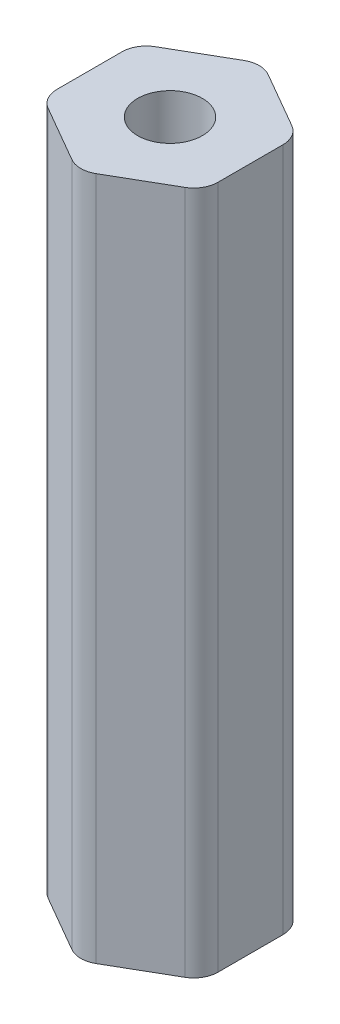
ISO-10303-21;
HEADER;
FILE_DESCRIPTION(('STEP AP214'),'2;1');
FILE_NAME('part.step','',(''),(''),'','','');
FILE_SCHEMA(('AUTOMOTIVE_DESIGN { 1 0 10303 214 1 1 1 1 }'));
ENDSEC;
DATA;
#1=APPLICATION_CONTEXT('core data for automotive mechanical design processes');
#2=APPLICATION_PROTOCOL_DEFINITION('international standard','automotive_design',2000,#1);
#3=PRODUCT_CONTEXT('',#1,'mechanical');
#4=PRODUCT('Part','Part','',(#3));
#5=PRODUCT_RELATED_PRODUCT_CATEGORY('part','',(#4));
#6=PRODUCT_DEFINITION_FORMATION('','',#4);
#7=PRODUCT_DEFINITION_CONTEXT('part definition',#1,'design');
#8=PRODUCT_DEFINITION('design','',#6,#7);
#9=PRODUCT_DEFINITION_SHAPE('','',#8);
#10=(LENGTH_UNIT() NAMED_UNIT(*) SI_UNIT(.MILLI.,.METRE.));
#11=(NAMED_UNIT(*) PLANE_ANGLE_UNIT() SI_UNIT($,.RADIAN.));
#12=(NAMED_UNIT(*) SI_UNIT($,.STERADIAN.) SOLID_ANGLE_UNIT());
#13=UNCERTAINTY_MEASURE_WITH_UNIT(LENGTH_MEASURE(1.E-05),#10,'distance_accuracy_value','');
#14=(GEOMETRIC_REPRESENTATION_CONTEXT(3) GLOBAL_UNCERTAINTY_ASSIGNED_CONTEXT((#13)) GLOBAL_UNIT_ASSIGNED_CONTEXT((#10,
#11,#12)) REPRESENTATION_CONTEXT('',''));
#15=CARTESIAN_POINT('',(0.,0.,0.));
#16=DIRECTION('',(0.,0.,1.));
#17=DIRECTION('',(1.,0.,0.));
#18=AXIS2_PLACEMENT_3D('',#15,#16,#17);
#19=CARTESIAN_POINT('',(0.,53.975,0.));
#20=DIRECTION('',(0.,1.,0.));
#21=DIRECTION('',(0.,0.,1.));
#22=AXIS2_PLACEMENT_3D('',#19,#20,#21);
#23=PLANE('',#22);
#24=DIRECTION('',(-0.866025403784438,0.,0.500000000000001));
#25=VECTOR('',#24,1.);
#26=CARTESIAN_POINT('',(0.,53.975,-7.33234841870824));
#27=LINE('',#26,#25);
#28=CARTESIAN_POINT('',(-0.952499999999994,53.975,-6.78242228730512));
#29=VERTEX_POINT('',#28);
#30=CARTESIAN_POINT('',(-5.3975,53.975,-4.21610034075723));
#31=VERTEX_POINT('',#30);
#32=EDGE_CURVE('E245',#29,#31,#27,.T.);
#33=ORIENTED_EDGE('',*,*,#32,.T.);
#34=CARTESIAN_POINT('',(-4.445,53.975,-2.56632194654787));
#35=DIRECTION('',(0.,1.,0.));
#36=DIRECTION('',(0.,0.,1.));
#37=AXIS2_PLACEMENT_3D('',#34,#35,#36);
#38=CIRCLE('',#37,1.905);
#39=CARTESIAN_POINT('',(-6.35,53.975,-2.56632194654786));
#40=VERTEX_POINT('',#39);
#41=EDGE_CURVE('E195',#31,#40,#38,.T.);
#42=ORIENTED_EDGE('',*,*,#41,.T.);
#43=DIRECTION('',(0.,0.,1.));
#44=VECTOR('',#43,1.);
#45=CARTESIAN_POINT('',(-6.35,53.975,-3.6661742093541));
#46=LINE('',#45,#44);
#47=CARTESIAN_POINT('',(-6.34999999999998,53.975,2.56632194654791));
#48=VERTEX_POINT('',#47);
#49=EDGE_CURVE('E151',#40,#48,#46,.T.);
#50=ORIENTED_EDGE('',*,*,#49,.T.);
#51=CARTESIAN_POINT('',(-4.44499999999998,53.975,2.5663219465479));
#52=DIRECTION('',(0.,1.,0.));
#53=DIRECTION('',(0.,0.,1.));
#54=AXIS2_PLACEMENT_3D('',#51,#52,#53);
#55=CIRCLE('',#54,1.905);
#56=CARTESIAN_POINT('',(-5.39749999999997,53.975,4.21610034075726));
#57=VERTEX_POINT('',#56);
#58=EDGE_CURVE('E189',#48,#57,#55,.T.);
#59=ORIENTED_EDGE('',*,*,#58,.T.);
#60=DIRECTION('',(0.866025403784442,0.,0.499999999999995));
#61=VECTOR('',#60,1.);
#62=CARTESIAN_POINT('',(-6.34999999999998,53.975,3.66617420935415));
#63=LINE('',#62,#61);
#64=CARTESIAN_POINT('',(-0.952499999999955,53.975,6.78242228730512));
#65=VERTEX_POINT('',#64);
#66=EDGE_CURVE('E227',#57,#65,#63,.T.);
#67=ORIENTED_EDGE('',*,*,#66,.T.);
#68=CARTESIAN_POINT('',(0.,53.975,5.13264389309576));
#69=DIRECTION('',(0.,1.,0.));
#70=DIRECTION('',(0.,0.,1.));
#71=AXIS2_PLACEMENT_3D('',#68,#69,#70);
#72=CIRCLE('',#71,1.905);
#73=CARTESIAN_POINT('',(0.952500000000049,53.975,6.78242228730511));
#74=VERTEX_POINT('',#73);
#75=EDGE_CURVE('E186',#65,#74,#72,.T.);
#76=ORIENTED_EDGE('',*,*,#75,.T.);
#77=DIRECTION('',(0.866025403784435,0.,-0.500000000000007));
#78=VECTOR('',#77,1.);
#79=CARTESIAN_POINT('',(0.,53.975,7.33234841870824));
#80=LINE('',#79,#78);
#81=CARTESIAN_POINT('',(5.39750000000003,53.975,4.21610034075719));
#82=VERTEX_POINT('',#81);
#83=EDGE_CURVE('E217',#74,#82,#80,.T.);
#84=ORIENTED_EDGE('',*,*,#83,.T.);
#85=CARTESIAN_POINT('',(4.44500000000001,53.975,2.56632194654784));
#86=DIRECTION('',(0.,1.,0.));
#87=DIRECTION('',(0.,0.,1.));
#88=AXIS2_PLACEMENT_3D('',#85,#86,#87);
#89=CIRCLE('',#88,1.905);
#90=CARTESIAN_POINT('',(6.35000000000001,53.975,2.56632194654782));
#91=VERTEX_POINT('',#90);
#92=EDGE_CURVE('E63',#82,#91,#89,.T.);
#93=ORIENTED_EDGE('',*,*,#92,.T.);
#94=DIRECTION('',(0.,0.,-1.));
#95=VECTOR('',#94,1.);
#96=CARTESIAN_POINT('',(6.35000000000002,53.975,3.66617420935406));
#97=LINE('',#96,#95);
#98=CARTESIAN_POINT('',(6.34999999999996,53.975,-2.56632194654796));
#99=VERTEX_POINT('',#98);
#100=EDGE_CURVE('E174',#91,#99,#97,.T.);
#101=ORIENTED_EDGE('',*,*,#100,.T.);
#102=CARTESIAN_POINT('',(4.44499999999996,53.975,-2.56632194654794));
#103=DIRECTION('',(0.,1.,0.));
#104=DIRECTION('',(0.,0.,1.));
#105=AXIS2_PLACEMENT_3D('',#102,#103,#104);
#106=CIRCLE('',#105,1.905);
#107=CARTESIAN_POINT('',(5.39749999999995,53.975,-4.2161003407573));
#108=VERTEX_POINT('',#107);
#109=EDGE_CURVE('E191',#99,#108,#106,.T.);
#110=ORIENTED_EDGE('',*,*,#109,.T.);
#111=DIRECTION('',(-0.866025403784441,0.,-0.499999999999995));
#112=VECTOR('',#111,1.);
#113=CARTESIAN_POINT('',(6.34999999999995,53.975,-3.66617420935419));
#114=LINE('',#113,#112);
#115=CARTESIAN_POINT('',(0.952499999999998,53.975,-6.78242228730513));
#116=VERTEX_POINT('',#115);
#117=EDGE_CURVE('E173',#108,#116,#114,.T.);
#118=ORIENTED_EDGE('',*,*,#117,.T.);
#119=CARTESIAN_POINT('',(0.,53.975,-5.13264389309577));
#120=DIRECTION('',(0.,1.,0.));
#121=DIRECTION('',(0.,0.,1.));
#122=AXIS2_PLACEMENT_3D('',#119,#120,#121);
#123=CIRCLE('',#122,1.905);
#124=EDGE_CURVE('E193',#116,#29,#123,.T.);
#125=ORIENTED_EDGE('',*,*,#124,.T.);
#126=EDGE_LOOP('',(#33,#42,#50,#59,#67,#76,#84,#93,#101,#110,#118,#125));
#127=FACE_BOUND('',#126,.T.);
#128=CARTESIAN_POINT('',(0.,53.975,0.));
#129=DIRECTION('',(0.,1.,0.));
#130=DIRECTION('',(0.,0.,1.));
#131=AXIS2_PLACEMENT_3D('',#128,#129,#130);
#132=CIRCLE('',#131,2.5527);
#133=CARTESIAN_POINT('',(0.,53.975,2.5527));
#134=VERTEX_POINT('',#133);
#135=EDGE_CURVE('E231',#134,#134,#132,.T.);
#136=ORIENTED_EDGE('',*,*,#135,.F.);
#137=EDGE_LOOP('',(#136));
#138=FACE_BOUND('',#137,.T.);
#139=ADVANCED_FACE('F41',(#127,#138),#23,.T.);
#140=CARTESIAN_POINT('',(0.,0.,0.));
#141=DIRECTION('',(0.,1.,0.));
#142=DIRECTION('',(0.,0.,1.));
#143=AXIS2_PLACEMENT_3D('',#140,#141,#142);
#144=PLANE('',#143);
#145=DIRECTION('',(0.,0.,1.));
#146=VECTOR('',#145,1.);
#147=CARTESIAN_POINT('',(-6.35,0.,-3.6661742093541));
#148=LINE('',#147,#146);
#149=CARTESIAN_POINT('',(-6.35,0.,-2.56632194654786));
#150=VERTEX_POINT('',#149);
#151=CARTESIAN_POINT('',(-6.34999999999998,0.,2.56632194654791));
#152=VERTEX_POINT('',#151);
#153=EDGE_CURVE('E148',#150,#152,#148,.T.);
#154=ORIENTED_EDGE('',*,*,#153,.F.);
#155=CARTESIAN_POINT('',(-4.445,0.,-2.56632194654787));
#156=DIRECTION('',(0.,1.,0.));
#157=DIRECTION('',(0.,0.,1.));
#158=AXIS2_PLACEMENT_3D('',#155,#156,#157);
#159=CIRCLE('',#158,1.905);
#160=CARTESIAN_POINT('',(-5.3975,0.,-4.21610034075723));
#161=VERTEX_POINT('',#160);
#162=EDGE_CURVE('E131',#150,#161,#159,.F.);
#163=ORIENTED_EDGE('',*,*,#162,.T.);
#164=DIRECTION('',(-0.866025403784438,0.,0.500000000000001));
#165=VECTOR('',#164,1.);
#166=CARTESIAN_POINT('',(0.,0.,-7.33234841870824));
#167=LINE('',#166,#165);
#168=CARTESIAN_POINT('',(-0.952499999999994,0.,-6.78242228730512));
#169=VERTEX_POINT('',#168);
#170=EDGE_CURVE('E160',#169,#161,#167,.T.);
#171=ORIENTED_EDGE('',*,*,#170,.F.);
#172=CARTESIAN_POINT('',(0.,0.,-5.13264389309577));
#173=DIRECTION('',(0.,1.,0.));
#174=DIRECTION('',(0.,0.,1.));
#175=AXIS2_PLACEMENT_3D('',#172,#173,#174);
#176=CIRCLE('',#175,1.905);
#177=CARTESIAN_POINT('',(0.952499999999998,0.,-6.78242228730513));
#178=VERTEX_POINT('',#177);
#179=EDGE_CURVE('E142',#169,#178,#176,.F.);
#180=ORIENTED_EDGE('',*,*,#179,.T.);
#181=DIRECTION('',(-0.866025403784441,0.,-0.499999999999995));
#182=VECTOR('',#181,1.);
#183=CARTESIAN_POINT('',(6.34999999999995,0.,-3.66617420935419));
#184=LINE('',#183,#182);
#185=CARTESIAN_POINT('',(5.39749999999995,0.,-4.2161003407573));
#186=VERTEX_POINT('',#185);
#187=EDGE_CURVE('E165',#186,#178,#184,.T.);
#188=ORIENTED_EDGE('',*,*,#187,.F.);
#189=CARTESIAN_POINT('',(4.44499999999996,0.,-2.56632194654794));
#190=DIRECTION('',(0.,1.,0.));
#191=DIRECTION('',(0.,0.,1.));
#192=AXIS2_PLACEMENT_3D('',#189,#190,#191);
#193=CIRCLE('',#192,1.905);
#194=CARTESIAN_POINT('',(6.34999999999996,0.,-2.56632194654796));
#195=VERTEX_POINT('',#194);
#196=EDGE_CURVE('E180',#186,#195,#193,.F.);
#197=ORIENTED_EDGE('',*,*,#196,.T.);
#198=DIRECTION('',(0.,0.,-1.));
#199=VECTOR('',#198,1.);
#200=CARTESIAN_POINT('',(6.35000000000002,0.,3.66617420935406));
#201=LINE('',#200,#199);
#202=CARTESIAN_POINT('',(6.35000000000001,0.,2.56632194654782));
#203=VERTEX_POINT('',#202);
#204=EDGE_CURVE('E171',#203,#195,#201,.T.);
#205=ORIENTED_EDGE('',*,*,#204,.F.);
#206=CARTESIAN_POINT('',(4.44500000000001,0.,2.56632194654784));
#207=DIRECTION('',(0.,1.,0.));
#208=DIRECTION('',(0.,0.,1.));
#209=AXIS2_PLACEMENT_3D('',#206,#207,#208);
#210=CIRCLE('',#209,1.905);
#211=CARTESIAN_POINT('',(5.39750000000003,0.,4.21610034075719));
#212=VERTEX_POINT('',#211);
#213=EDGE_CURVE('E177',#203,#212,#210,.F.);
#214=ORIENTED_EDGE('',*,*,#213,.T.);
#215=DIRECTION('',(0.866025403784435,0.,-0.500000000000007));
#216=VECTOR('',#215,1.);
#217=CARTESIAN_POINT('',(0.,0.,7.33234841870824));
#218=LINE('',#217,#216);
#219=CARTESIAN_POINT('',(0.952500000000049,0.,6.78242228730511));
#220=VERTEX_POINT('',#219);
#221=EDGE_CURVE('E163',#220,#212,#218,.T.);
#222=ORIENTED_EDGE('',*,*,#221,.F.);
#223=CARTESIAN_POINT('',(0.,0.,5.13264389309576));
#224=DIRECTION('',(0.,1.,0.));
#225=DIRECTION('',(0.,0.,1.));
#226=AXIS2_PLACEMENT_3D('',#223,#224,#225);
#227=CIRCLE('',#226,1.905);
#228=CARTESIAN_POINT('',(-0.952499999999955,0.,6.78242228730512));
#229=VERTEX_POINT('',#228);
#230=EDGE_CURVE('E152',#220,#229,#227,.F.);
#231=ORIENTED_EDGE('',*,*,#230,.T.);
#232=DIRECTION('',(0.866025403784442,0.,0.499999999999995));
#233=VECTOR('',#232,1.);
#234=CARTESIAN_POINT('',(-6.34999999999998,0.,3.66617420935415));
#235=LINE('',#234,#233);
#236=CARTESIAN_POINT('',(-5.39749999999997,0.,4.21610034075726));
#237=VERTEX_POINT('',#236);
#238=EDGE_CURVE('E159',#237,#229,#235,.T.);
#239=ORIENTED_EDGE('',*,*,#238,.F.);
#240=CARTESIAN_POINT('',(-4.44499999999998,0.,2.5663219465479));
#241=DIRECTION('',(0.,1.,0.));
#242=DIRECTION('',(0.,0.,1.));
#243=AXIS2_PLACEMENT_3D('',#240,#241,#242);
#244=CIRCLE('',#243,1.905);
#245=EDGE_CURVE('E158',#237,#152,#244,.F.);
#246=ORIENTED_EDGE('',*,*,#245,.T.);
#247=EDGE_LOOP('',(#154,#163,#171,#180,#188,#197,#205,#214,#222,#231,#239,#246));
#248=FACE_BOUND('',#247,.T.);
#249=CARTESIAN_POINT('',(0.,0.,0.));
#250=DIRECTION('',(0.,1.,0.));
#251=DIRECTION('',(0.,0.,1.));
#252=AXIS2_PLACEMENT_3D('',#249,#250,#251);
#253=CIRCLE('',#252,2.5527);
#254=CARTESIAN_POINT('',(0.,0.,2.5527));
#255=VERTEX_POINT('',#254);
#256=EDGE_CURVE('E236',#255,#255,#253,.T.);
#257=ORIENTED_EDGE('',*,*,#256,.T.);
#258=EDGE_LOOP('',(#257));
#259=FACE_BOUND('',#258,.T.);
#260=ADVANCED_FACE('F155',(#248,#259),#144,.F.);
#261=CARTESIAN_POINT('',(6.34999999999995,53.975,-3.66617420935419));
#262=DIRECTION('',(-0.499999999999995,0.,0.866025403784441));
#263=DIRECTION('',(0.866025403784441,0.,0.499999999999995));
#264=AXIS2_PLACEMENT_3D('',#261,#262,#263);
#265=PLANE('',#264);
#266=ORIENTED_EDGE('',*,*,#187,.T.);
#267=DIRECTION('',(0.,-1.,0.));
#268=VECTOR('',#267,1.);
#269=CARTESIAN_POINT('',(0.952499999999998,53.975,-6.78242228730513));
#270=LINE('',#269,#268);
#271=EDGE_CURVE('E200',#178,#116,#270,.F.);
#272=ORIENTED_EDGE('',*,*,#271,.T.);
#273=ORIENTED_EDGE('',*,*,#117,.F.);
#274=DIRECTION('',(0.,-1.,0.));
#275=VECTOR('',#274,1.);
#276=CARTESIAN_POINT('',(5.39749999999995,53.975,-4.2161003407573));
#277=LINE('',#276,#275);
#278=EDGE_CURVE('E197',#108,#186,#277,.T.);
#279=ORIENTED_EDGE('',*,*,#278,.T.);
#280=EDGE_LOOP('',(#266,#272,#273,#279));
#281=FACE_BOUND('',#280,.T.);
#282=ADVANCED_FACE('F269',(#281),#265,.F.);
#283=CARTESIAN_POINT('',(0.,53.975,-7.33234841870824));
#284=DIRECTION('',(0.500000000000001,0.,0.866025403784438));
#285=DIRECTION('',(0.866025403784438,0.,-0.500000000000001));
#286=AXIS2_PLACEMENT_3D('',#283,#284,#285);
#287=PLANE('',#286);
#288=ORIENTED_EDGE('',*,*,#170,.T.);
#289=DIRECTION('',(0.,-1.,0.));
#290=VECTOR('',#289,1.);
#291=CARTESIAN_POINT('',(-5.3975,53.975,-4.21610034075722));
#292=LINE('',#291,#290);
#293=EDGE_CURVE('E136',#161,#31,#292,.F.);
#294=ORIENTED_EDGE('',*,*,#293,.T.);
#295=ORIENTED_EDGE('',*,*,#32,.F.);
#296=DIRECTION('',(0.,-1.,0.));
#297=VECTOR('',#296,1.);
#298=CARTESIAN_POINT('',(-0.952499999999994,53.975,-6.78242228730512));
#299=LINE('',#298,#297);
#300=EDGE_CURVE('E141',#29,#169,#299,.T.);
#301=ORIENTED_EDGE('',*,*,#300,.T.);
#302=EDGE_LOOP('',(#288,#294,#295,#301));
#303=FACE_BOUND('',#302,.T.);
#304=ADVANCED_FACE('F262',(#303),#287,.F.);
#305=CARTESIAN_POINT('',(-6.35,53.975,-3.6661742093541));
#306=DIRECTION('',(1.,0.,0.));
#307=DIRECTION('',(0.,0.,-1.));
#308=AXIS2_PLACEMENT_3D('',#305,#306,#307);
#309=PLANE('',#308);
#310=ORIENTED_EDGE('',*,*,#49,.F.);
#311=DIRECTION('',(0.,-1.,0.));
#312=VECTOR('',#311,1.);
#313=CARTESIAN_POINT('',(-6.35,53.975,-2.56632194654786));
#314=LINE('',#313,#312);
#315=EDGE_CURVE('E135',#40,#150,#314,.T.);
#316=ORIENTED_EDGE('',*,*,#315,.T.);
#317=ORIENTED_EDGE('',*,*,#153,.T.);
#318=DIRECTION('',(0.,-1.,0.));
#319=VECTOR('',#318,1.);
#320=CARTESIAN_POINT('',(-6.34999999999998,53.975,2.56632194654791));
#321=LINE('',#320,#319);
#322=EDGE_CURVE('E153',#152,#48,#321,.F.);
#323=ORIENTED_EDGE('',*,*,#322,.T.);
#324=EDGE_LOOP('',(#310,#316,#317,#323));
#325=FACE_BOUND('',#324,.T.);
#326=ADVANCED_FACE('F147',(#325),#309,.F.);
#327=CARTESIAN_POINT('',(-6.34999999999998,53.975,3.66617420935415));
#328=DIRECTION('',(0.499999999999995,0.,-0.866025403784442));
#329=DIRECTION('',(-0.866025403784442,0.,-0.499999999999995));
#330=AXIS2_PLACEMENT_3D('',#327,#328,#329);
#331=PLANE('',#330);
#332=ORIENTED_EDGE('',*,*,#66,.F.);
#333=DIRECTION('',(0.,-1.,0.));
#334=VECTOR('',#333,1.);
#335=CARTESIAN_POINT('',(-5.39749999999997,53.975,4.21610034075726));
#336=LINE('',#335,#334);
#337=EDGE_CURVE('E208',#57,#237,#336,.T.);
#338=ORIENTED_EDGE('',*,*,#337,.T.);
#339=ORIENTED_EDGE('',*,*,#238,.T.);
#340=DIRECTION('',(0.,-1.,0.));
#341=VECTOR('',#340,1.);
#342=CARTESIAN_POINT('',(-0.952499999999955,53.975,6.78242228730512));
#343=LINE('',#342,#341);
#344=EDGE_CURVE('E206',#229,#65,#343,.F.);
#345=ORIENTED_EDGE('',*,*,#344,.T.);
#346=EDGE_LOOP('',(#332,#338,#339,#345));
#347=FACE_BOUND('',#346,.T.);
#348=ADVANCED_FACE('F255',(#347),#331,.F.);
#349=CARTESIAN_POINT('',(0.,53.975,7.33234841870824));
#350=DIRECTION('',(-0.500000000000007,0.,-0.866025403784435));
#351=DIRECTION('',(-0.866025403784435,0.,0.500000000000007));
#352=AXIS2_PLACEMENT_3D('',#349,#350,#351);
#353=PLANE('',#352);
#354=ORIENTED_EDGE('',*,*,#221,.T.);
#355=DIRECTION('',(0.,-1.,0.));
#356=VECTOR('',#355,1.);
#357=CARTESIAN_POINT('',(5.39750000000003,53.975,4.21610034075719));
#358=LINE('',#357,#356);
#359=EDGE_CURVE('E11',#212,#82,#358,.F.);
#360=ORIENTED_EDGE('',*,*,#359,.T.);
#361=ORIENTED_EDGE('',*,*,#83,.F.);
#362=DIRECTION('',(0.,-1.,0.));
#363=VECTOR('',#362,1.);
#364=CARTESIAN_POINT('',(0.952500000000048,53.975,6.78242228730511));
#365=LINE('',#364,#363);
#366=EDGE_CURVE('E49',#74,#220,#365,.T.);
#367=ORIENTED_EDGE('',*,*,#366,.T.);
#368=EDGE_LOOP('',(#354,#360,#361,#367));
#369=FACE_BOUND('',#368,.T.);
#370=ADVANCED_FACE('F215',(#369),#353,.F.);
#371=CARTESIAN_POINT('',(6.35000000000002,53.975,3.66617420935406));
#372=DIRECTION('',(-1.,0.,0.));
#373=DIRECTION('',(0.,0.,1.));
#374=AXIS2_PLACEMENT_3D('',#371,#372,#373);
#375=PLANE('',#374);
#376=ORIENTED_EDGE('',*,*,#204,.T.);
#377=DIRECTION('',(0.,-1.,0.));
#378=VECTOR('',#377,1.);
#379=CARTESIAN_POINT('',(6.34999999999996,53.975,-2.56632194654796));
#380=LINE('',#379,#378);
#381=EDGE_CURVE('E56',#195,#99,#380,.F.);
#382=ORIENTED_EDGE('',*,*,#381,.T.);
#383=ORIENTED_EDGE('',*,*,#100,.F.);
#384=DIRECTION('',(0.,-1.,0.));
#385=VECTOR('',#384,1.);
#386=CARTESIAN_POINT('',(6.35000000000001,53.975,2.56632194654782));
#387=LINE('',#386,#385);
#388=EDGE_CURVE('E202',#91,#203,#387,.T.);
#389=ORIENTED_EDGE('',*,*,#388,.T.);
#390=EDGE_LOOP('',(#376,#382,#383,#389));
#391=FACE_BOUND('',#390,.T.);
#392=ADVANCED_FACE('F224',(#391),#375,.F.);
#393=CARTESIAN_POINT('',(0.,53.975,0.));
#394=DIRECTION('',(0.,-1.,0.));
#395=DIRECTION('',(0.,0.,-1.));
#396=AXIS2_PLACEMENT_3D('',#393,#394,#395);
#397=CYLINDRICAL_SURFACE('',#396,2.5527);
#398=ORIENTED_EDGE('',*,*,#135,.T.);
#399=EDGE_LOOP('',(#398));
#400=FACE_BOUND('',#399,.T.);
#401=ORIENTED_EDGE('',*,*,#256,.F.);
#402=EDGE_LOOP('',(#401));
#403=FACE_BOUND('',#402,.T.);
#404=ADVANCED_FACE('F285',(#400,#403),#397,.F.);
#405=CARTESIAN_POINT('',(-4.445,53.975,-2.56632194654787));
#406=DIRECTION('',(0.,-1.,0.));
#407=DIRECTION('',(0.,0.,-1.));
#408=AXIS2_PLACEMENT_3D('',#405,#406,#407);
#409=CYLINDRICAL_SURFACE('',#408,1.905);
#410=ORIENTED_EDGE('',*,*,#41,.F.);
#411=ORIENTED_EDGE('',*,*,#293,.F.);
#412=ORIENTED_EDGE('',*,*,#162,.F.);
#413=ORIENTED_EDGE('',*,*,#315,.F.);
#414=EDGE_LOOP('',(#410,#411,#412,#413));
#415=FACE_BOUND('',#414,.T.);
#416=ADVANCED_FACE('F134',(#415),#409,.T.);
#417=CARTESIAN_POINT('',(0.,53.975,-5.13264389309577));
#418=DIRECTION('',(0.,-1.,0.));
#419=DIRECTION('',(0.,0.,-1.));
#420=AXIS2_PLACEMENT_3D('',#417,#418,#419);
#421=CYLINDRICAL_SURFACE('',#420,1.905);
#422=ORIENTED_EDGE('',*,*,#124,.F.);
#423=ORIENTED_EDGE('',*,*,#271,.F.);
#424=ORIENTED_EDGE('',*,*,#179,.F.);
#425=ORIENTED_EDGE('',*,*,#300,.F.);
#426=EDGE_LOOP('',(#422,#423,#424,#425));
#427=FACE_BOUND('',#426,.T.);
#428=ADVANCED_FACE('F264',(#427),#421,.T.);
#429=CARTESIAN_POINT('',(4.44499999999996,53.975,-2.56632194654794));
#430=DIRECTION('',(0.,-1.,0.));
#431=DIRECTION('',(0.,0.,-1.));
#432=AXIS2_PLACEMENT_3D('',#429,#430,#431);
#433=CYLINDRICAL_SURFACE('',#432,1.905);
#434=ORIENTED_EDGE('',*,*,#109,.F.);
#435=ORIENTED_EDGE('',*,*,#381,.F.);
#436=ORIENTED_EDGE('',*,*,#196,.F.);
#437=ORIENTED_EDGE('',*,*,#278,.F.);
#438=EDGE_LOOP('',(#434,#435,#436,#437));
#439=FACE_BOUND('',#438,.T.);
#440=ADVANCED_FACE('F267',(#439),#433,.T.);
#441=CARTESIAN_POINT('',(-4.44499999999998,53.975,2.5663219465479));
#442=DIRECTION('',(0.,-1.,0.));
#443=DIRECTION('',(0.,0.,-1.));
#444=AXIS2_PLACEMENT_3D('',#441,#442,#443);
#445=CYLINDRICAL_SURFACE('',#444,1.905);
#446=ORIENTED_EDGE('',*,*,#58,.F.);
#447=ORIENTED_EDGE('',*,*,#322,.F.);
#448=ORIENTED_EDGE('',*,*,#245,.F.);
#449=ORIENTED_EDGE('',*,*,#337,.F.);
#450=EDGE_LOOP('',(#446,#447,#448,#449));
#451=FACE_BOUND('',#450,.T.);
#452=ADVANCED_FACE('F257',(#451),#445,.T.);
#453=CARTESIAN_POINT('',(4.44500000000001,53.975,2.56632194654784));
#454=DIRECTION('',(0.,-1.,0.));
#455=DIRECTION('',(0.,0.,-1.));
#456=AXIS2_PLACEMENT_3D('',#453,#454,#455);
#457=CYLINDRICAL_SURFACE('',#456,1.905);
#458=ORIENTED_EDGE('',*,*,#92,.F.);
#459=ORIENTED_EDGE('',*,*,#359,.F.);
#460=ORIENTED_EDGE('',*,*,#213,.F.);
#461=ORIENTED_EDGE('',*,*,#388,.F.);
#462=EDGE_LOOP('',(#458,#459,#460,#461));
#463=FACE_BOUND('',#462,.T.);
#464=ADVANCED_FACE('F223',(#463),#457,.T.);
#465=CARTESIAN_POINT('',(0.,53.975,5.13264389309576));
#466=DIRECTION('',(0.,-1.,0.));
#467=DIRECTION('',(0.,0.,-1.));
#468=AXIS2_PLACEMENT_3D('',#465,#466,#467);
#469=CYLINDRICAL_SURFACE('',#468,1.905);
#470=ORIENTED_EDGE('',*,*,#75,.F.);
#471=ORIENTED_EDGE('',*,*,#344,.F.);
#472=ORIENTED_EDGE('',*,*,#230,.F.);
#473=ORIENTED_EDGE('',*,*,#366,.F.);
#474=EDGE_LOOP('',(#470,#471,#472,#473));
#475=FACE_BOUND('',#474,.T.);
#476=ADVANCED_FACE('F43',(#475),#469,.T.);
#477=CLOSED_SHELL('',(#139,#260,#282,#304,#326,#348,#370,#392,#404,#416,#428,#440,#452,#464,#476));
#478=MANIFOLD_SOLID_BREP('B2',#477);
#479=ADVANCED_BREP_SHAPE_REPRESENTATION('',(#18,#478),#14);
#480=SHAPE_DEFINITION_REPRESENTATION(#9,#479);
ENDSEC;
END-ISO-10303-21;
